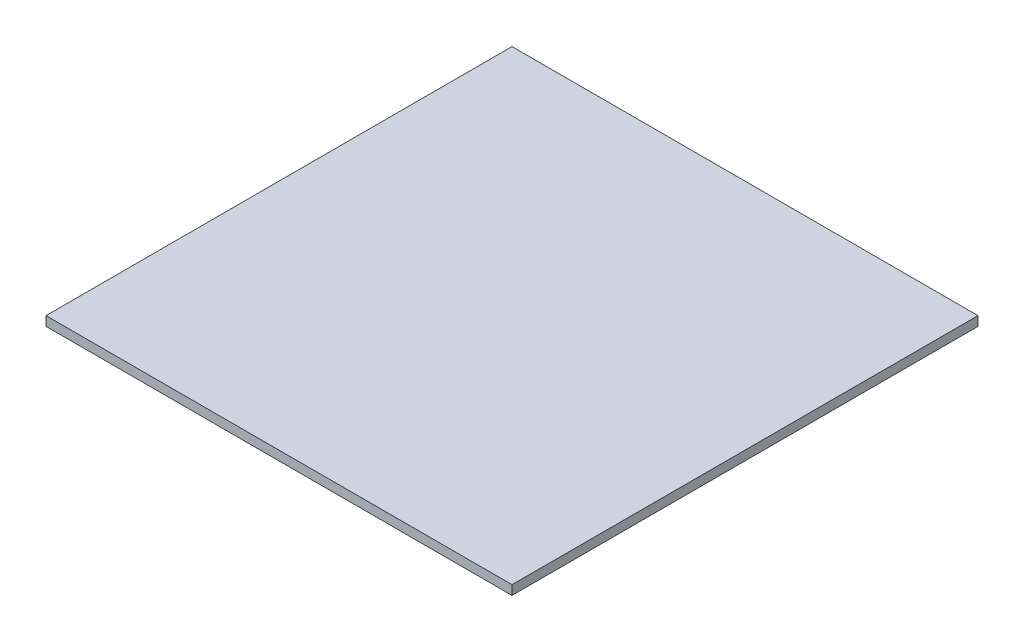
ISO-10303-21;
HEADER;
FILE_DESCRIPTION(('STEP AP214'),'2;1');
FILE_NAME('part.step','',(''),(''),'','','');
FILE_SCHEMA(('AUTOMOTIVE_DESIGN { 1 0 10303 214 1 1 1 1 }'));
ENDSEC;
DATA;
#1=APPLICATION_CONTEXT('core data for automotive mechanical design processes');
#2=APPLICATION_PROTOCOL_DEFINITION('international standard','automotive_design',2000,#1);
#3=PRODUCT_CONTEXT('',#1,'mechanical');
#4=PRODUCT('Part','Part','',(#3));
#5=PRODUCT_RELATED_PRODUCT_CATEGORY('part','',(#4));
#6=PRODUCT_DEFINITION_FORMATION('','',#4);
#7=PRODUCT_DEFINITION_CONTEXT('part definition',#1,'design');
#8=PRODUCT_DEFINITION('design','',#6,#7);
#9=PRODUCT_DEFINITION_SHAPE('','',#8);
#10=(LENGTH_UNIT() NAMED_UNIT(*) SI_UNIT(.MILLI.,.METRE.));
#11=(NAMED_UNIT(*) PLANE_ANGLE_UNIT() SI_UNIT($,.RADIAN.));
#12=(NAMED_UNIT(*) SI_UNIT($,.STERADIAN.) SOLID_ANGLE_UNIT());
#13=UNCERTAINTY_MEASURE_WITH_UNIT(LENGTH_MEASURE(1.E-05),#10,'distance_accuracy_value','');
#14=(GEOMETRIC_REPRESENTATION_CONTEXT(3) GLOBAL_UNCERTAINTY_ASSIGNED_CONTEXT((#13)) GLOBAL_UNIT_ASSIGNED_CONTEXT((#10,
#11,#12)) REPRESENTATION_CONTEXT('',''));
#15=CARTESIAN_POINT('',(0.,0.,0.));
#16=DIRECTION('',(0.,0.,1.));
#17=DIRECTION('',(1.,0.,0.));
#18=AXIS2_PLACEMENT_3D('',#15,#16,#17);
#19=CARTESIAN_POINT('',(0.,-5.,0.));
#20=DIRECTION('',(-1.,0.,0.));
#21=DIRECTION('',(0.,0.,1.));
#22=AXIS2_PLACEMENT_3D('',#19,#20,#21);
#23=PLANE('',#22);
#24=DIRECTION('',(0.,0.,1.));
#25=VECTOR('',#24,1.);
#26=CARTESIAN_POINT('',(0.,0.,0.));
#27=LINE('',#26,#25);
#28=CARTESIAN_POINT('',(0.,0.,-250.));
#29=VERTEX_POINT('',#28);
#30=CARTESIAN_POINT('',(0.,0.,0.));
#31=VERTEX_POINT('',#30);
#32=EDGE_CURVE('E109',#29,#31,#27,.T.);
#33=ORIENTED_EDGE('',*,*,#32,.F.);
#34=DIRECTION('',(0.,1.,0.));
#35=VECTOR('',#34,1.);
#36=CARTESIAN_POINT('',(0.,-5.,-250.));
#37=LINE('',#36,#35);
#38=CARTESIAN_POINT('',(0.,-5.,-250.));
#39=VERTEX_POINT('',#38);
#40=EDGE_CURVE('E11',#39,#29,#37,.T.);
#41=ORIENTED_EDGE('',*,*,#40,.F.);
#42=DIRECTION('',(0.,0.,1.));
#43=VECTOR('',#42,1.);
#44=CARTESIAN_POINT('',(0.,-5.,0.));
#45=LINE('',#44,#43);
#46=CARTESIAN_POINT('',(0.,-5.,0.));
#47=VERTEX_POINT('',#46);
#48=EDGE_CURVE('E101',#39,#47,#45,.T.);
#49=ORIENTED_EDGE('',*,*,#48,.T.);
#50=DIRECTION('',(0.,1.,0.));
#51=VECTOR('',#50,1.);
#52=CARTESIAN_POINT('',(0.,-5.,0.));
#53=LINE('',#52,#51);
#54=EDGE_CURVE('E42',#47,#31,#53,.T.);
#55=ORIENTED_EDGE('',*,*,#54,.T.);
#56=EDGE_LOOP('',(#33,#41,#49,#55));
#57=FACE_BOUND('',#56,.T.);
#58=ADVANCED_FACE('F39',(#57),#23,.T.);
#59=CARTESIAN_POINT('',(0.,-5.,-250.));
#60=DIRECTION('',(0.,0.,-1.));
#61=DIRECTION('',(-1.,0.,0.));
#62=AXIS2_PLACEMENT_3D('',#59,#60,#61);
#63=PLANE('',#62);
#64=DIRECTION('',(-1.,0.,0.));
#65=VECTOR('',#64,1.);
#66=CARTESIAN_POINT('',(0.,0.,-250.));
#67=LINE('',#66,#65);
#68=CARTESIAN_POINT('',(250.,0.,-250.));
#69=VERTEX_POINT('',#68);
#70=EDGE_CURVE('E104',#69,#29,#67,.T.);
#71=ORIENTED_EDGE('',*,*,#70,.F.);
#72=DIRECTION('',(0.,1.,0.));
#73=VECTOR('',#72,1.);
#74=CARTESIAN_POINT('',(250.,-5.,-250.));
#75=LINE('',#74,#73);
#76=CARTESIAN_POINT('',(250.,-5.,-250.));
#77=VERTEX_POINT('',#76);
#78=EDGE_CURVE('E49',#77,#69,#75,.T.);
#79=ORIENTED_EDGE('',*,*,#78,.F.);
#80=DIRECTION('',(-1.,0.,0.));
#81=VECTOR('',#80,1.);
#82=CARTESIAN_POINT('',(0.,-5.,-250.));
#83=LINE('',#82,#81);
#84=EDGE_CURVE('E96',#77,#39,#83,.T.);
#85=ORIENTED_EDGE('',*,*,#84,.T.);
#86=ORIENTED_EDGE('',*,*,#40,.T.);
#87=EDGE_LOOP('',(#71,#79,#85,#86));
#88=FACE_BOUND('',#87,.T.);
#89=ADVANCED_FACE('F125',(#88),#63,.T.);
#90=CARTESIAN_POINT('',(250.,-5.,0.));
#91=DIRECTION('',(1.,0.,0.));
#92=DIRECTION('',(0.,0.,-1.));
#93=AXIS2_PLACEMENT_3D('',#90,#91,#92);
#94=PLANE('',#93);
#95=DIRECTION('',(0.,0.,-1.));
#96=VECTOR('',#95,1.);
#97=CARTESIAN_POINT('',(250.,0.,0.));
#98=LINE('',#97,#96);
#99=CARTESIAN_POINT('',(250.,0.,0.));
#100=VERTEX_POINT('',#99);
#101=EDGE_CURVE('E90',#100,#69,#98,.T.);
#102=ORIENTED_EDGE('',*,*,#101,.F.);
#103=DIRECTION('',(0.,1.,0.));
#104=VECTOR('',#103,1.);
#105=CARTESIAN_POINT('',(250.,-5.,0.));
#106=LINE('',#105,#104);
#107=CARTESIAN_POINT('',(250.,-5.,0.));
#108=VERTEX_POINT('',#107);
#109=EDGE_CURVE('E85',#108,#100,#106,.T.);
#110=ORIENTED_EDGE('',*,*,#109,.F.);
#111=DIRECTION('',(0.,0.,-1.));
#112=VECTOR('',#111,1.);
#113=CARTESIAN_POINT('',(250.,-5.,0.));
#114=LINE('',#113,#112);
#115=EDGE_CURVE('E88',#108,#77,#114,.T.);
#116=ORIENTED_EDGE('',*,*,#115,.T.);
#117=ORIENTED_EDGE('',*,*,#78,.T.);
#118=EDGE_LOOP('',(#102,#110,#116,#117));
#119=FACE_BOUND('',#118,.T.);
#120=ADVANCED_FACE('F87',(#119),#94,.T.);
#121=CARTESIAN_POINT('',(0.,-5.,0.));
#122=DIRECTION('',(0.,0.,1.));
#123=DIRECTION('',(1.,0.,0.));
#124=AXIS2_PLACEMENT_3D('',#121,#122,#123);
#125=PLANE('',#124);
#126=DIRECTION('',(1.,0.,0.));
#127=VECTOR('',#126,1.);
#128=CARTESIAN_POINT('',(0.,0.,0.));
#129=LINE('',#128,#127);
#130=EDGE_CURVE('E113',#31,#100,#129,.T.);
#131=ORIENTED_EDGE('',*,*,#130,.F.);
#132=ORIENTED_EDGE('',*,*,#54,.F.);
#133=DIRECTION('',(1.,0.,0.));
#134=VECTOR('',#133,1.);
#135=CARTESIAN_POINT('',(0.,-5.,0.));
#136=LINE('',#135,#134);
#137=EDGE_CURVE('E95',#47,#108,#136,.T.);
#138=ORIENTED_EDGE('',*,*,#137,.T.);
#139=ORIENTED_EDGE('',*,*,#109,.T.);
#140=EDGE_LOOP('',(#131,#132,#138,#139));
#141=FACE_BOUND('',#140,.T.);
#142=ADVANCED_FACE('F99',(#141),#125,.T.);
#143=CARTESIAN_POINT('',(0.,-5.,0.));
#144=DIRECTION('',(0.,-1.,0.));
#145=DIRECTION('',(0.,0.,-1.));
#146=AXIS2_PLACEMENT_3D('',#143,#144,#145);
#147=PLANE('',#146);
#148=ORIENTED_EDGE('',*,*,#48,.F.);
#149=ORIENTED_EDGE('',*,*,#84,.F.);
#150=ORIENTED_EDGE('',*,*,#115,.F.);
#151=ORIENTED_EDGE('',*,*,#137,.F.);
#152=EDGE_LOOP('',(#148,#149,#150,#151));
#153=FACE_BOUND('',#152,.T.);
#154=ADVANCED_FACE('F94',(#153),#147,.T.);
#155=CARTESIAN_POINT('',(0.,0.,0.));
#156=DIRECTION('',(0.,-1.,0.));
#157=DIRECTION('',(0.,0.,-1.));
#158=AXIS2_PLACEMENT_3D('',#155,#156,#157);
#159=PLANE('',#158);
#160=ORIENTED_EDGE('',*,*,#32,.T.);
#161=ORIENTED_EDGE('',*,*,#130,.T.);
#162=ORIENTED_EDGE('',*,*,#101,.T.);
#163=ORIENTED_EDGE('',*,*,#70,.T.);
#164=EDGE_LOOP('',(#160,#161,#162,#163));
#165=FACE_BOUND('',#164,.T.);
#166=ADVANCED_FACE('F124',(#165),#159,.F.);
#167=CLOSED_SHELL('',(#58,#89,#120,#142,#154,#166));
#168=MANIFOLD_SOLID_BREP('B2',#167);
#169=ADVANCED_BREP_SHAPE_REPRESENTATION('',(#18,#168),#14);
#170=SHAPE_DEFINITION_REPRESENTATION(#9,#169);
ENDSEC;
END-ISO-10303-21;
